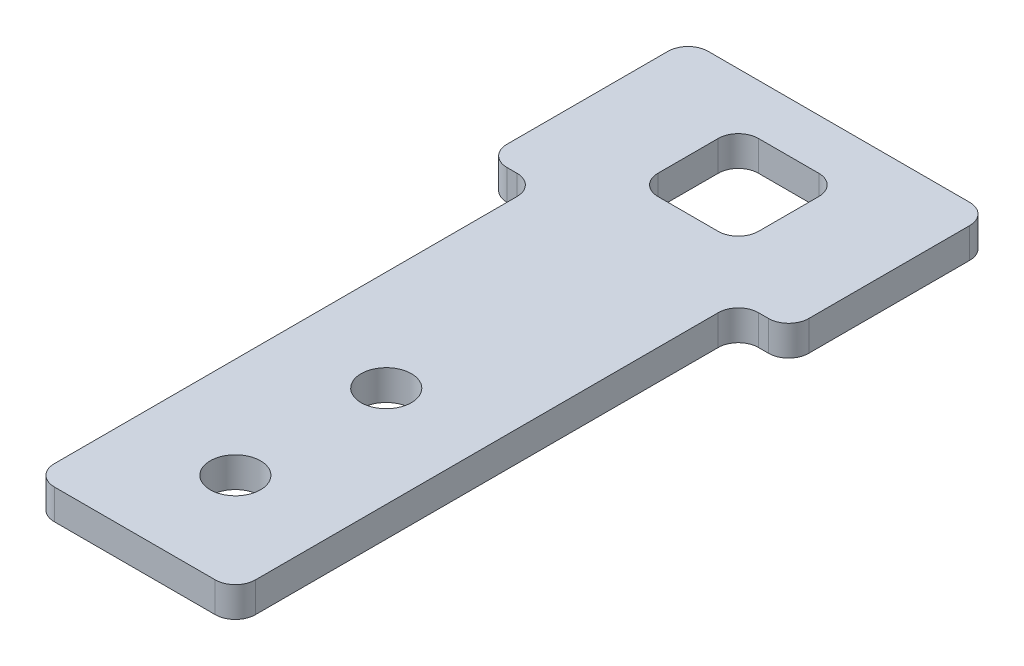
ISO-10303-21;
HEADER;
FILE_DESCRIPTION(('STEP AP214'),'2;1');
FILE_NAME('part.step','',(''),(''),'','','');
FILE_SCHEMA(('AUTOMOTIVE_DESIGN { 1 0 10303 214 1 1 1 1 }'));
ENDSEC;
DATA;
#1=APPLICATION_CONTEXT('core data for automotive mechanical design processes');
#2=APPLICATION_PROTOCOL_DEFINITION('international standard','automotive_design',2000,#1);
#3=PRODUCT_CONTEXT('',#1,'mechanical');
#4=PRODUCT('Part','Part','',(#3));
#5=PRODUCT_RELATED_PRODUCT_CATEGORY('part','',(#4));
#6=PRODUCT_DEFINITION_FORMATION('','',#4);
#7=PRODUCT_DEFINITION_CONTEXT('part definition',#1,'design');
#8=PRODUCT_DEFINITION('design','',#6,#7);
#9=PRODUCT_DEFINITION_SHAPE('','',#8);
#10=(LENGTH_UNIT() NAMED_UNIT(*) SI_UNIT(.MILLI.,.METRE.));
#11=(NAMED_UNIT(*) PLANE_ANGLE_UNIT() SI_UNIT($,.RADIAN.));
#12=(NAMED_UNIT(*) SI_UNIT($,.STERADIAN.) SOLID_ANGLE_UNIT());
#13=UNCERTAINTY_MEASURE_WITH_UNIT(LENGTH_MEASURE(1.E-05),#10,'distance_accuracy_value','');
#14=(GEOMETRIC_REPRESENTATION_CONTEXT(3) GLOBAL_UNCERTAINTY_ASSIGNED_CONTEXT((#13)) GLOBAL_UNIT_ASSIGNED_CONTEXT((#10,
#11,#12)) REPRESENTATION_CONTEXT('',''));
#15=CARTESIAN_POINT('',(0.,0.,0.));
#16=DIRECTION('',(0.,0.,1.));
#17=DIRECTION('',(1.,0.,0.));
#18=AXIS2_PLACEMENT_3D('',#15,#16,#17);
#19=CARTESIAN_POINT('',(5.00000000000001,-3.,0.));
#20=DIRECTION('',(-1.,0.,0.));
#21=DIRECTION('',(0.,0.,1.));
#22=AXIS2_PLACEMENT_3D('',#19,#20,#21);
#23=PLANE('',#22);
#24=DIRECTION('',(0.,0.,1.));
#25=VECTOR('',#24,1.);
#26=CARTESIAN_POINT('',(5.00000000000001,0.,0.));
#27=LINE('',#26,#25);
#28=CARTESIAN_POINT('',(5.,0.,-63.));
#29=VERTEX_POINT('',#28);
#30=CARTESIAN_POINT('',(5.,0.,-57.));
#31=VERTEX_POINT('',#30);
#32=EDGE_CURVE('E286',#29,#31,#27,.T.);
#33=ORIENTED_EDGE('',*,*,#32,.T.);
#34=DIRECTION('',(0.,1.,0.));
#35=VECTOR('',#34,1.);
#36=CARTESIAN_POINT('',(5.,-3.,-57.));
#37=LINE('',#36,#35);
#38=CARTESIAN_POINT('',(5.,-3.,-57.));
#39=VERTEX_POINT('',#38);
#40=EDGE_CURVE('E11',#39,#31,#37,.T.);
#41=ORIENTED_EDGE('',*,*,#40,.F.);
#42=DIRECTION('',(0.,0.,1.));
#43=VECTOR('',#42,1.);
#44=CARTESIAN_POINT('',(5.00000000000001,-3.,0.));
#45=LINE('',#44,#43);
#46=CARTESIAN_POINT('',(5.,-3.,-63.));
#47=VERTEX_POINT('',#46);
#48=EDGE_CURVE('E56',#47,#39,#45,.T.);
#49=ORIENTED_EDGE('',*,*,#48,.F.);
#50=DIRECTION('',(0.,1.,0.));
#51=VECTOR('',#50,1.);
#52=CARTESIAN_POINT('',(5.,-3.,-63.));
#53=LINE('',#52,#51);
#54=EDGE_CURVE('E315',#47,#29,#53,.T.);
#55=ORIENTED_EDGE('',*,*,#54,.T.);
#56=EDGE_LOOP('',(#33,#41,#49,#55));
#57=FACE_BOUND('',#56,.T.);
#58=ADVANCED_FACE('F37',(#57),#23,.F.);
#59=CARTESIAN_POINT('',(7.,-3.,-57.));
#60=DIRECTION('',(0.,1.,0.));
#61=DIRECTION('',(0.,0.,1.));
#62=AXIS2_PLACEMENT_3D('',#59,#60,#61);
#63=CYLINDRICAL_SURFACE('',#62,2.);
#64=CARTESIAN_POINT('',(7.,0.,-57.));
#65=DIRECTION('',(0.,1.,0.));
#66=DIRECTION('',(0.,0.,1.));
#67=AXIS2_PLACEMENT_3D('',#64,#65,#66);
#68=CIRCLE('',#67,2.);
#69=CARTESIAN_POINT('',(7.,0.,-55.));
#70=VERTEX_POINT('',#69);
#71=EDGE_CURVE('E303',#70,#31,#68,.F.);
#72=ORIENTED_EDGE('',*,*,#71,.F.);
#73=DIRECTION('',(0.,1.,0.));
#74=VECTOR('',#73,1.);
#75=CARTESIAN_POINT('',(7.,-3.,-55.));
#76=LINE('',#75,#74);
#77=CARTESIAN_POINT('',(7.,-3.,-55.));
#78=VERTEX_POINT('',#77);
#79=EDGE_CURVE('E47',#78,#70,#76,.T.);
#80=ORIENTED_EDGE('',*,*,#79,.F.);
#81=CARTESIAN_POINT('',(7.,-3.,-57.));
#82=DIRECTION('',(0.,1.,0.));
#83=DIRECTION('',(0.,0.,1.));
#84=AXIS2_PLACEMENT_3D('',#81,#82,#83);
#85=CIRCLE('',#84,2.);
#86=EDGE_CURVE('E212',#78,#39,#85,.F.);
#87=ORIENTED_EDGE('',*,*,#86,.T.);
#88=ORIENTED_EDGE('',*,*,#40,.T.);
#89=EDGE_LOOP('',(#72,#80,#87,#88));
#90=FACE_BOUND('',#89,.T.);
#91=ADVANCED_FACE('F372',(#90),#63,.F.);
#92=CARTESIAN_POINT('',(0.,-3.,-55.));
#93=DIRECTION('',(0.,0.,1.));
#94=DIRECTION('',(1.,0.,0.));
#95=AXIS2_PLACEMENT_3D('',#92,#93,#94);
#96=PLANE('',#95);
#97=DIRECTION('',(1.,0.,0.));
#98=VECTOR('',#97,1.);
#99=CARTESIAN_POINT('',(0.,0.,-55.));
#100=LINE('',#99,#98);
#101=CARTESIAN_POINT('',(13.,0.,-55.));
#102=VERTEX_POINT('',#101);
#103=EDGE_CURVE('E217',#70,#102,#100,.T.);
#104=ORIENTED_EDGE('',*,*,#103,.T.);
#105=DIRECTION('',(0.,1.,0.));
#106=VECTOR('',#105,1.);
#107=CARTESIAN_POINT('',(13.,-3.,-55.));
#108=LINE('',#107,#106);
#109=CARTESIAN_POINT('',(13.,-3.,-55.));
#110=VERTEX_POINT('',#109);
#111=EDGE_CURVE('E215',#110,#102,#108,.T.);
#112=ORIENTED_EDGE('',*,*,#111,.F.);
#113=DIRECTION('',(1.,0.,0.));
#114=VECTOR('',#113,1.);
#115=CARTESIAN_POINT('',(0.,-3.,-55.));
#116=LINE('',#115,#114);
#117=EDGE_CURVE('E205',#78,#110,#116,.T.);
#118=ORIENTED_EDGE('',*,*,#117,.F.);
#119=ORIENTED_EDGE('',*,*,#79,.T.);
#120=EDGE_LOOP('',(#104,#112,#118,#119));
#121=FACE_BOUND('',#120,.T.);
#122=ADVANCED_FACE('F216',(#121),#96,.F.);
#123=CARTESIAN_POINT('',(13.,-3.,-57.));
#124=DIRECTION('',(0.,1.,0.));
#125=DIRECTION('',(0.,0.,1.));
#126=AXIS2_PLACEMENT_3D('',#123,#124,#125);
#127=CYLINDRICAL_SURFACE('',#126,2.);
#128=CARTESIAN_POINT('',(13.,0.,-57.));
#129=DIRECTION('',(0.,1.,0.));
#130=DIRECTION('',(0.,0.,1.));
#131=AXIS2_PLACEMENT_3D('',#128,#129,#130);
#132=CIRCLE('',#131,2.);
#133=CARTESIAN_POINT('',(15.,0.,-57.));
#134=VERTEX_POINT('',#133);
#135=EDGE_CURVE('E300',#102,#134,#132,.T.);
#136=ORIENTED_EDGE('',*,*,#135,.T.);
#137=DIRECTION('',(0.,1.,0.));
#138=VECTOR('',#137,1.);
#139=CARTESIAN_POINT('',(15.,-3.,-57.));
#140=LINE('',#139,#138);
#141=CARTESIAN_POINT('',(15.,-3.,-57.));
#142=VERTEX_POINT('',#141);
#143=EDGE_CURVE('E221',#142,#134,#140,.T.);
#144=ORIENTED_EDGE('',*,*,#143,.F.);
#145=CARTESIAN_POINT('',(13.,-3.,-57.));
#146=DIRECTION('',(0.,1.,0.));
#147=DIRECTION('',(0.,0.,1.));
#148=AXIS2_PLACEMENT_3D('',#145,#146,#147);
#149=CIRCLE('',#148,2.);
#150=EDGE_CURVE('E210',#110,#142,#149,.T.);
#151=ORIENTED_EDGE('',*,*,#150,.F.);
#152=ORIENTED_EDGE('',*,*,#111,.T.);
#153=EDGE_LOOP('',(#136,#144,#151,#152));
#154=FACE_BOUND('',#153,.T.);
#155=ADVANCED_FACE('F223',(#154),#127,.F.);
#156=CARTESIAN_POINT('',(15.,-3.,0.));
#157=DIRECTION('',(-1.,0.,0.));
#158=DIRECTION('',(0.,0.,1.));
#159=AXIS2_PLACEMENT_3D('',#156,#157,#158);
#160=PLANE('',#159);
#161=DIRECTION('',(0.,0.,1.));
#162=VECTOR('',#161,1.);
#163=CARTESIAN_POINT('',(15.,0.,0.));
#164=LINE('',#163,#162);
#165=CARTESIAN_POINT('',(15.,0.,-63.));
#166=VERTEX_POINT('',#165);
#167=EDGE_CURVE('E297',#166,#134,#164,.T.);
#168=ORIENTED_EDGE('',*,*,#167,.F.);
#169=DIRECTION('',(0.,1.,0.));
#170=VECTOR('',#169,1.);
#171=CARTESIAN_POINT('',(15.,-3.,-63.));
#172=LINE('',#171,#170);
#173=CARTESIAN_POINT('',(15.,-3.,-63.));
#174=VERTEX_POINT('',#173);
#175=EDGE_CURVE('E309',#174,#166,#172,.T.);
#176=ORIENTED_EDGE('',*,*,#175,.F.);
#177=DIRECTION('',(0.,0.,1.));
#178=VECTOR('',#177,1.);
#179=CARTESIAN_POINT('',(15.,-3.,0.));
#180=LINE('',#179,#178);
#181=EDGE_CURVE('E225',#174,#142,#180,.T.);
#182=ORIENTED_EDGE('',*,*,#181,.T.);
#183=ORIENTED_EDGE('',*,*,#143,.T.);
#184=EDGE_LOOP('',(#168,#176,#182,#183));
#185=FACE_BOUND('',#184,.T.);
#186=ADVANCED_FACE('F504',(#185),#160,.T.);
#187=CARTESIAN_POINT('',(13.,-3.,-63.));
#188=DIRECTION('',(0.,1.,0.));
#189=DIRECTION('',(0.,0.,1.));
#190=AXIS2_PLACEMENT_3D('',#187,#188,#189);
#191=CYLINDRICAL_SURFACE('',#190,2.);
#192=CARTESIAN_POINT('',(13.,0.,-63.));
#193=DIRECTION('',(0.,1.,0.));
#194=DIRECTION('',(0.,0.,1.));
#195=AXIS2_PLACEMENT_3D('',#192,#193,#194);
#196=CIRCLE('',#195,2.);
#197=CARTESIAN_POINT('',(13.,0.,-65.));
#198=VERTEX_POINT('',#197);
#199=EDGE_CURVE('E294',#166,#198,#196,.T.);
#200=ORIENTED_EDGE('',*,*,#199,.T.);
#201=DIRECTION('',(0.,1.,0.));
#202=VECTOR('',#201,1.);
#203=CARTESIAN_POINT('',(13.,-3.,-65.));
#204=LINE('',#203,#202);
#205=CARTESIAN_POINT('',(13.,-3.,-65.));
#206=VERTEX_POINT('',#205);
#207=EDGE_CURVE('E311',#206,#198,#204,.T.);
#208=ORIENTED_EDGE('',*,*,#207,.F.);
#209=CARTESIAN_POINT('',(13.,-3.,-63.));
#210=DIRECTION('',(0.,1.,0.));
#211=DIRECTION('',(0.,0.,1.));
#212=AXIS2_PLACEMENT_3D('',#209,#210,#211);
#213=CIRCLE('',#212,2.);
#214=EDGE_CURVE('E227',#174,#206,#213,.T.);
#215=ORIENTED_EDGE('',*,*,#214,.F.);
#216=ORIENTED_EDGE('',*,*,#175,.T.);
#217=EDGE_LOOP('',(#200,#208,#215,#216));
#218=FACE_BOUND('',#217,.T.);
#219=ADVANCED_FACE('F494',(#218),#191,.F.);
#220=CARTESIAN_POINT('',(0.,-3.,-65.));
#221=DIRECTION('',(0.,0.,1.));
#222=DIRECTION('',(1.,0.,0.));
#223=AXIS2_PLACEMENT_3D('',#220,#221,#222);
#224=PLANE('',#223);
#225=DIRECTION('',(1.,0.,0.));
#226=VECTOR('',#225,1.);
#227=CARTESIAN_POINT('',(0.,0.,-65.));
#228=LINE('',#227,#226);
#229=CARTESIAN_POINT('',(7.,0.,-65.));
#230=VERTEX_POINT('',#229);
#231=EDGE_CURVE('E291',#230,#198,#228,.T.);
#232=ORIENTED_EDGE('',*,*,#231,.F.);
#233=DIRECTION('',(0.,1.,0.));
#234=VECTOR('',#233,1.);
#235=CARTESIAN_POINT('',(7.,-3.,-65.));
#236=LINE('',#235,#234);
#237=CARTESIAN_POINT('',(7.,-3.,-65.));
#238=VERTEX_POINT('',#237);
#239=EDGE_CURVE('E313',#238,#230,#236,.T.);
#240=ORIENTED_EDGE('',*,*,#239,.F.);
#241=DIRECTION('',(1.,0.,0.));
#242=VECTOR('',#241,1.);
#243=CARTESIAN_POINT('',(0.,-3.,-65.));
#244=LINE('',#243,#242);
#245=EDGE_CURVE('E488',#238,#206,#244,.T.);
#246=ORIENTED_EDGE('',*,*,#245,.T.);
#247=ORIENTED_EDGE('',*,*,#207,.T.);
#248=EDGE_LOOP('',(#232,#240,#246,#247));
#249=FACE_BOUND('',#248,.T.);
#250=ADVANCED_FACE('F498',(#249),#224,.T.);
#251=CARTESIAN_POINT('',(0.,-3.,-70.));
#252=DIRECTION('',(0.,0.,1.));
#253=DIRECTION('',(1.,0.,0.));
#254=AXIS2_PLACEMENT_3D('',#251,#252,#253);
#255=PLANE('',#254);
#256=DIRECTION('',(1.,0.,0.));
#257=VECTOR('',#256,1.);
#258=CARTESIAN_POINT('',(0.,0.,-70.));
#259=LINE('',#258,#257);
#260=CARTESIAN_POINT('',(-3.,0.,-70.));
#261=VERTEX_POINT('',#260);
#262=CARTESIAN_POINT('',(23.,0.,-70.));
#263=VERTEX_POINT('',#262);
#264=EDGE_CURVE('E238',#261,#263,#259,.T.);
#265=ORIENTED_EDGE('',*,*,#264,.T.);
#266=DIRECTION('',(0.,1.,0.));
#267=VECTOR('',#266,1.);
#268=CARTESIAN_POINT('',(23.,-3.,-70.));
#269=LINE('',#268,#267);
#270=CARTESIAN_POINT('',(23.,-3.,-70.));
#271=VERTEX_POINT('',#270);
#272=EDGE_CURVE('E317',#271,#263,#269,.T.);
#273=ORIENTED_EDGE('',*,*,#272,.F.);
#274=DIRECTION('',(1.,0.,0.));
#275=VECTOR('',#274,1.);
#276=CARTESIAN_POINT('',(0.,-3.,-70.));
#277=LINE('',#276,#275);
#278=CARTESIAN_POINT('',(-3.,-3.,-70.));
#279=VERTEX_POINT('',#278);
#280=EDGE_CURVE('E350',#279,#271,#277,.T.);
#281=ORIENTED_EDGE('',*,*,#280,.F.);
#282=DIRECTION('',(0.,1.,0.));
#283=VECTOR('',#282,1.);
#284=CARTESIAN_POINT('',(-3.,-3.,-70.));
#285=LINE('',#284,#283);
#286=EDGE_CURVE('E41',#279,#261,#285,.T.);
#287=ORIENTED_EDGE('',*,*,#286,.T.);
#288=EDGE_LOOP('',(#265,#273,#281,#287));
#289=FACE_BOUND('',#288,.T.);
#290=ADVANCED_FACE('F348',(#289),#255,.F.);
#291=CARTESIAN_POINT('',(23.,-3.,-68.));
#292=DIRECTION('',(0.,1.,0.));
#293=DIRECTION('',(0.,0.,1.));
#294=AXIS2_PLACEMENT_3D('',#291,#292,#293);
#295=CYLINDRICAL_SURFACE('',#294,2.);
#296=CARTESIAN_POINT('',(23.,0.,-68.));
#297=DIRECTION('',(0.,1.,0.));
#298=DIRECTION('',(0.,0.,1.));
#299=AXIS2_PLACEMENT_3D('',#296,#297,#298);
#300=CIRCLE('',#299,2.);
#301=CARTESIAN_POINT('',(25.,0.,-68.));
#302=VERTEX_POINT('',#301);
#303=EDGE_CURVE('E283',#302,#263,#300,.T.);
#304=ORIENTED_EDGE('',*,*,#303,.F.);
#305=DIRECTION('',(0.,1.,0.));
#306=VECTOR('',#305,1.);
#307=CARTESIAN_POINT('',(25.,-3.,-68.));
#308=LINE('',#307,#306);
#309=CARTESIAN_POINT('',(25.,-3.,-68.));
#310=VERTEX_POINT('',#309);
#311=EDGE_CURVE('E319',#310,#302,#308,.T.);
#312=ORIENTED_EDGE('',*,*,#311,.F.);
#313=CARTESIAN_POINT('',(23.,-3.,-68.));
#314=DIRECTION('',(0.,1.,0.));
#315=DIRECTION('',(0.,0.,1.));
#316=AXIS2_PLACEMENT_3D('',#313,#314,#315);
#317=CIRCLE('',#316,2.);
#318=EDGE_CURVE('E481',#310,#271,#317,.T.);
#319=ORIENTED_EDGE('',*,*,#318,.T.);
#320=ORIENTED_EDGE('',*,*,#272,.T.);
#321=EDGE_LOOP('',(#304,#312,#319,#320));
#322=FACE_BOUND('',#321,.T.);
#323=ADVANCED_FACE('F383',(#322),#295,.T.);
#324=CARTESIAN_POINT('',(25.,-3.,0.));
#325=DIRECTION('',(-1.,0.,0.));
#326=DIRECTION('',(0.,0.,1.));
#327=AXIS2_PLACEMENT_3D('',#324,#325,#326);
#328=PLANE('',#327);
#329=DIRECTION('',(0.,0.,1.));
#330=VECTOR('',#329,1.);
#331=CARTESIAN_POINT('',(25.,0.,0.));
#332=LINE('',#331,#330);
#333=CARTESIAN_POINT('',(25.,0.,-52.));
#334=VERTEX_POINT('',#333);
#335=EDGE_CURVE('E280',#302,#334,#332,.T.);
#336=ORIENTED_EDGE('',*,*,#335,.T.);
#337=DIRECTION('',(0.,1.,0.));
#338=VECTOR('',#337,1.);
#339=CARTESIAN_POINT('',(25.,-3.,-52.));
#340=LINE('',#339,#338);
#341=CARTESIAN_POINT('',(25.,-3.,-52.));
#342=VERTEX_POINT('',#341);
#343=EDGE_CURVE('E321',#342,#334,#340,.T.);
#344=ORIENTED_EDGE('',*,*,#343,.F.);
#345=DIRECTION('',(0.,0.,1.));
#346=VECTOR('',#345,1.);
#347=CARTESIAN_POINT('',(25.,-3.,0.));
#348=LINE('',#347,#346);
#349=EDGE_CURVE('E479',#310,#342,#348,.T.);
#350=ORIENTED_EDGE('',*,*,#349,.F.);
#351=ORIENTED_EDGE('',*,*,#311,.T.);
#352=EDGE_LOOP('',(#336,#344,#350,#351));
#353=FACE_BOUND('',#352,.T.);
#354=ADVANCED_FACE('F386',(#353),#328,.F.);
#355=CARTESIAN_POINT('',(23.,-3.,-52.));
#356=DIRECTION('',(0.,1.,0.));
#357=DIRECTION('',(0.,0.,1.));
#358=AXIS2_PLACEMENT_3D('',#355,#356,#357);
#359=CYLINDRICAL_SURFACE('',#358,2.);
#360=CARTESIAN_POINT('',(23.,0.,-52.));
#361=DIRECTION('',(0.,1.,0.));
#362=DIRECTION('',(0.,0.,1.));
#363=AXIS2_PLACEMENT_3D('',#360,#361,#362);
#364=CIRCLE('',#363,2.);
#365=CARTESIAN_POINT('',(23.,0.,-50.));
#366=VERTEX_POINT('',#365);
#367=EDGE_CURVE('E277',#366,#334,#364,.T.);
#368=ORIENTED_EDGE('',*,*,#367,.F.);
#369=DIRECTION('',(0.,1.,0.));
#370=VECTOR('',#369,1.);
#371=CARTESIAN_POINT('',(23.,-3.,-50.));
#372=LINE('',#371,#370);
#373=CARTESIAN_POINT('',(23.,-3.,-50.));
#374=VERTEX_POINT('',#373);
#375=EDGE_CURVE('E323',#374,#366,#372,.T.);
#376=ORIENTED_EDGE('',*,*,#375,.F.);
#377=CARTESIAN_POINT('',(23.,-3.,-52.));
#378=DIRECTION('',(0.,1.,0.));
#379=DIRECTION('',(0.,0.,1.));
#380=AXIS2_PLACEMENT_3D('',#377,#378,#379);
#381=CIRCLE('',#380,2.);
#382=EDGE_CURVE('E476',#374,#342,#381,.T.);
#383=ORIENTED_EDGE('',*,*,#382,.T.);
#384=ORIENTED_EDGE('',*,*,#343,.T.);
#385=EDGE_LOOP('',(#368,#376,#383,#384));
#386=FACE_BOUND('',#385,.T.);
#387=ADVANCED_FACE('F390',(#386),#359,.T.);
#388=CARTESIAN_POINT('',(0.,-3.,-50.));
#389=DIRECTION('',(0.,0.,1.));
#390=DIRECTION('',(1.,0.,0.));
#391=AXIS2_PLACEMENT_3D('',#388,#389,#390);
#392=PLANE('',#391);
#393=DIRECTION('',(1.,0.,0.));
#394=VECTOR('',#393,1.);
#395=CARTESIAN_POINT('',(0.,0.,-50.));
#396=LINE('',#395,#394);
#397=CARTESIAN_POINT('',(22.,0.,-50.));
#398=VERTEX_POINT('',#397);
#399=EDGE_CURVE('E274',#398,#366,#396,.T.);
#400=ORIENTED_EDGE('',*,*,#399,.F.);
#401=DIRECTION('',(0.,1.,0.));
#402=VECTOR('',#401,1.);
#403=CARTESIAN_POINT('',(22.,-3.,-50.));
#404=LINE('',#403,#402);
#405=CARTESIAN_POINT('',(22.,-3.,-50.));
#406=VERTEX_POINT('',#405);
#407=EDGE_CURVE('E325',#406,#398,#404,.T.);
#408=ORIENTED_EDGE('',*,*,#407,.F.);
#409=DIRECTION('',(1.,0.,0.));
#410=VECTOR('',#409,1.);
#411=CARTESIAN_POINT('',(0.,-3.,-50.));
#412=LINE('',#411,#410);
#413=EDGE_CURVE('E473',#406,#374,#412,.T.);
#414=ORIENTED_EDGE('',*,*,#413,.T.);
#415=ORIENTED_EDGE('',*,*,#375,.T.);
#416=EDGE_LOOP('',(#400,#408,#414,#415));
#417=FACE_BOUND('',#416,.T.);
#418=ADVANCED_FACE('F394',(#417),#392,.T.);
#419=CARTESIAN_POINT('',(22.,-3.,-48.));
#420=DIRECTION('',(0.,1.,0.));
#421=DIRECTION('',(0.,0.,1.));
#422=AXIS2_PLACEMENT_3D('',#419,#420,#421);
#423=CYLINDRICAL_SURFACE('',#422,2.);
#424=CARTESIAN_POINT('',(22.,0.,-48.));
#425=DIRECTION('',(0.,1.,0.));
#426=DIRECTION('',(0.,0.,1.));
#427=AXIS2_PLACEMENT_3D('',#424,#425,#426);
#428=CIRCLE('',#427,2.);
#429=CARTESIAN_POINT('',(20.,0.,-48.));
#430=VERTEX_POINT('',#429);
#431=EDGE_CURVE('E271',#430,#398,#428,.F.);
#432=ORIENTED_EDGE('',*,*,#431,.F.);
#433=DIRECTION('',(0.,1.,0.));
#434=VECTOR('',#433,1.);
#435=CARTESIAN_POINT('',(20.,-3.,-48.));
#436=LINE('',#435,#434);
#437=CARTESIAN_POINT('',(20.,-3.,-48.));
#438=VERTEX_POINT('',#437);
#439=EDGE_CURVE('E327',#438,#430,#436,.T.);
#440=ORIENTED_EDGE('',*,*,#439,.F.);
#441=CARTESIAN_POINT('',(22.,-3.,-48.));
#442=DIRECTION('',(0.,1.,0.));
#443=DIRECTION('',(0.,0.,1.));
#444=AXIS2_PLACEMENT_3D('',#441,#442,#443);
#445=CIRCLE('',#444,2.);
#446=EDGE_CURVE('E470',#438,#406,#445,.F.);
#447=ORIENTED_EDGE('',*,*,#446,.T.);
#448=ORIENTED_EDGE('',*,*,#407,.T.);
#449=EDGE_LOOP('',(#432,#440,#447,#448));
#450=FACE_BOUND('',#449,.T.);
#451=ADVANCED_FACE('F398',(#450),#423,.F.);
#452=CARTESIAN_POINT('',(20.,-3.,0.));
#453=DIRECTION('',(-1.,0.,0.));
#454=DIRECTION('',(0.,0.,1.));
#455=AXIS2_PLACEMENT_3D('',#452,#453,#454);
#456=PLANE('',#455);
#457=DIRECTION('',(0.,0.,1.));
#458=VECTOR('',#457,1.);
#459=CARTESIAN_POINT('',(20.,0.,0.));
#460=LINE('',#459,#458);
#461=CARTESIAN_POINT('',(20.,0.,-2.00000000000001));
#462=VERTEX_POINT('',#461);
#463=EDGE_CURVE('E268',#430,#462,#460,.T.);
#464=ORIENTED_EDGE('',*,*,#463,.T.);
#465=DIRECTION('',(0.,1.,0.));
#466=VECTOR('',#465,1.);
#467=CARTESIAN_POINT('',(20.,-3.,-2.00000000000001));
#468=LINE('',#467,#466);
#469=CARTESIAN_POINT('',(20.,-3.,-2.00000000000001));
#470=VERTEX_POINT('',#469);
#471=EDGE_CURVE('E329',#470,#462,#468,.T.);
#472=ORIENTED_EDGE('',*,*,#471,.F.);
#473=DIRECTION('',(0.,0.,1.));
#474=VECTOR('',#473,1.);
#475=CARTESIAN_POINT('',(20.,-3.,0.));
#476=LINE('',#475,#474);
#477=EDGE_CURVE('E468',#438,#470,#476,.T.);
#478=ORIENTED_EDGE('',*,*,#477,.F.);
#479=ORIENTED_EDGE('',*,*,#439,.T.);
#480=EDGE_LOOP('',(#464,#472,#478,#479));
#481=FACE_BOUND('',#480,.T.);
#482=ADVANCED_FACE('F402',(#481),#456,.F.);
#483=CARTESIAN_POINT('',(18.,-3.,-2.));
#484=DIRECTION('',(0.,1.,0.));
#485=DIRECTION('',(0.,0.,1.));
#486=AXIS2_PLACEMENT_3D('',#483,#484,#485);
#487=CYLINDRICAL_SURFACE('',#486,2.);
#488=CARTESIAN_POINT('',(18.,0.,-2.));
#489=DIRECTION('',(0.,1.,0.));
#490=DIRECTION('',(0.,0.,1.));
#491=AXIS2_PLACEMENT_3D('',#488,#489,#490);
#492=CIRCLE('',#491,2.);
#493=CARTESIAN_POINT('',(18.,0.,0.));
#494=VERTEX_POINT('',#493);
#495=EDGE_CURVE('E265',#494,#462,#492,.T.);
#496=ORIENTED_EDGE('',*,*,#495,.F.);
#497=DIRECTION('',(0.,1.,0.));
#498=VECTOR('',#497,1.);
#499=CARTESIAN_POINT('',(18.,-3.,0.));
#500=LINE('',#499,#498);
#501=CARTESIAN_POINT('',(18.,-3.,0.));
#502=VERTEX_POINT('',#501);
#503=EDGE_CURVE('E331',#502,#494,#500,.T.);
#504=ORIENTED_EDGE('',*,*,#503,.F.);
#505=CARTESIAN_POINT('',(18.,-3.,-2.));
#506=DIRECTION('',(0.,1.,0.));
#507=DIRECTION('',(0.,0.,1.));
#508=AXIS2_PLACEMENT_3D('',#505,#506,#507);
#509=CIRCLE('',#508,2.);
#510=EDGE_CURVE('E465',#502,#470,#509,.T.);
#511=ORIENTED_EDGE('',*,*,#510,.T.);
#512=ORIENTED_EDGE('',*,*,#471,.T.);
#513=EDGE_LOOP('',(#496,#504,#511,#512));
#514=FACE_BOUND('',#513,.T.);
#515=ADVANCED_FACE('F406',(#514),#487,.T.);
#516=CARTESIAN_POINT('',(0.,-3.,0.));
#517=DIRECTION('',(0.,0.,1.));
#518=DIRECTION('',(1.,0.,0.));
#519=AXIS2_PLACEMENT_3D('',#516,#517,#518);
#520=PLANE('',#519);
#521=DIRECTION('',(1.,0.,0.));
#522=VECTOR('',#521,1.);
#523=CARTESIAN_POINT('',(0.,0.,0.));
#524=LINE('',#523,#522);
#525=CARTESIAN_POINT('',(2.00000000000001,0.,0.));
#526=VERTEX_POINT('',#525);
#527=EDGE_CURVE('E262',#526,#494,#524,.T.);
#528=ORIENTED_EDGE('',*,*,#527,.F.);
#529=DIRECTION('',(0.,1.,0.));
#530=VECTOR('',#529,1.);
#531=CARTESIAN_POINT('',(2.00000000000001,-3.,0.));
#532=LINE('',#531,#530);
#533=CARTESIAN_POINT('',(2.00000000000001,-3.,0.));
#534=VERTEX_POINT('',#533);
#535=EDGE_CURVE('E333',#534,#526,#532,.T.);
#536=ORIENTED_EDGE('',*,*,#535,.F.);
#537=DIRECTION('',(1.,0.,0.));
#538=VECTOR('',#537,1.);
#539=CARTESIAN_POINT('',(0.,-3.,0.));
#540=LINE('',#539,#538);
#541=EDGE_CURVE('E462',#534,#502,#540,.T.);
#542=ORIENTED_EDGE('',*,*,#541,.T.);
#543=ORIENTED_EDGE('',*,*,#503,.T.);
#544=EDGE_LOOP('',(#528,#536,#542,#543));
#545=FACE_BOUND('',#544,.T.);
#546=ADVANCED_FACE('F410',(#545),#520,.T.);
#547=CARTESIAN_POINT('',(2.,-3.,-2.));
#548=DIRECTION('',(0.,1.,0.));
#549=DIRECTION('',(0.,0.,1.));
#550=AXIS2_PLACEMENT_3D('',#547,#548,#549);
#551=CYLINDRICAL_SURFACE('',#550,2.);
#552=CARTESIAN_POINT('',(2.,0.,-2.));
#553=DIRECTION('',(0.,1.,0.));
#554=DIRECTION('',(0.,0.,1.));
#555=AXIS2_PLACEMENT_3D('',#552,#553,#554);
#556=CIRCLE('',#555,2.);
#557=CARTESIAN_POINT('',(0.,0.,-2.00000000000001));
#558=VERTEX_POINT('',#557);
#559=EDGE_CURVE('E259',#558,#526,#556,.T.);
#560=ORIENTED_EDGE('',*,*,#559,.F.);
#561=DIRECTION('',(0.,1.,0.));
#562=VECTOR('',#561,1.);
#563=CARTESIAN_POINT('',(0.,-3.,-2.00000000000001));
#564=LINE('',#563,#562);
#565=CARTESIAN_POINT('',(0.,-3.,-2.00000000000001));
#566=VERTEX_POINT('',#565);
#567=EDGE_CURVE('E335',#566,#558,#564,.T.);
#568=ORIENTED_EDGE('',*,*,#567,.F.);
#569=CARTESIAN_POINT('',(2.,-3.,-2.));
#570=DIRECTION('',(0.,1.,0.));
#571=DIRECTION('',(0.,0.,1.));
#572=AXIS2_PLACEMENT_3D('',#569,#570,#571);
#573=CIRCLE('',#572,2.);
#574=EDGE_CURVE('E459',#566,#534,#573,.T.);
#575=ORIENTED_EDGE('',*,*,#574,.T.);
#576=ORIENTED_EDGE('',*,*,#535,.T.);
#577=EDGE_LOOP('',(#560,#568,#575,#576));
#578=FACE_BOUND('',#577,.T.);
#579=ADVANCED_FACE('F414',(#578),#551,.T.);
#580=CARTESIAN_POINT('',(0.,-3.,0.));
#581=DIRECTION('',(-1.,0.,0.));
#582=DIRECTION('',(0.,0.,1.));
#583=AXIS2_PLACEMENT_3D('',#580,#581,#582);
#584=PLANE('',#583);
#585=DIRECTION('',(0.,0.,1.));
#586=VECTOR('',#585,1.);
#587=CARTESIAN_POINT('',(0.,0.,0.));
#588=LINE('',#587,#586);
#589=CARTESIAN_POINT('',(0.,0.,-48.));
#590=VERTEX_POINT('',#589);
#591=EDGE_CURVE('E256',#590,#558,#588,.T.);
#592=ORIENTED_EDGE('',*,*,#591,.F.);
#593=DIRECTION('',(0.,1.,0.));
#594=VECTOR('',#593,1.);
#595=CARTESIAN_POINT('',(0.,-3.,-48.));
#596=LINE('',#595,#594);
#597=CARTESIAN_POINT('',(0.,-3.,-48.));
#598=VERTEX_POINT('',#597);
#599=EDGE_CURVE('E337',#598,#590,#596,.T.);
#600=ORIENTED_EDGE('',*,*,#599,.F.);
#601=DIRECTION('',(0.,0.,1.));
#602=VECTOR('',#601,1.);
#603=CARTESIAN_POINT('',(0.,-3.,0.));
#604=LINE('',#603,#602);
#605=EDGE_CURVE('E456',#598,#566,#604,.T.);
#606=ORIENTED_EDGE('',*,*,#605,.T.);
#607=ORIENTED_EDGE('',*,*,#567,.T.);
#608=EDGE_LOOP('',(#592,#600,#606,#607));
#609=FACE_BOUND('',#608,.T.);
#610=ADVANCED_FACE('F418',(#609),#584,.T.);
#611=CARTESIAN_POINT('',(-2.,-3.,-48.));
#612=DIRECTION('',(0.,1.,0.));
#613=DIRECTION('',(0.,0.,1.));
#614=AXIS2_PLACEMENT_3D('',#611,#612,#613);
#615=CYLINDRICAL_SURFACE('',#614,2.);
#616=CARTESIAN_POINT('',(-2.,0.,-48.));
#617=DIRECTION('',(0.,1.,0.));
#618=DIRECTION('',(0.,0.,1.));
#619=AXIS2_PLACEMENT_3D('',#616,#617,#618);
#620=CIRCLE('',#619,2.);
#621=CARTESIAN_POINT('',(-2.,0.,-50.));
#622=VERTEX_POINT('',#621);
#623=EDGE_CURVE('E253',#622,#590,#620,.F.);
#624=ORIENTED_EDGE('',*,*,#623,.F.);
#625=DIRECTION('',(0.,1.,0.));
#626=VECTOR('',#625,1.);
#627=CARTESIAN_POINT('',(-2.,-3.,-50.));
#628=LINE('',#627,#626);
#629=CARTESIAN_POINT('',(-2.,-3.,-50.));
#630=VERTEX_POINT('',#629);
#631=EDGE_CURVE('E339',#630,#622,#628,.T.);
#632=ORIENTED_EDGE('',*,*,#631,.F.);
#633=CARTESIAN_POINT('',(-2.,-3.,-48.));
#634=DIRECTION('',(0.,1.,0.));
#635=DIRECTION('',(0.,0.,1.));
#636=AXIS2_PLACEMENT_3D('',#633,#634,#635);
#637=CIRCLE('',#636,2.);
#638=EDGE_CURVE('E453',#630,#598,#637,.F.);
#639=ORIENTED_EDGE('',*,*,#638,.T.);
#640=ORIENTED_EDGE('',*,*,#599,.T.);
#641=EDGE_LOOP('',(#624,#632,#639,#640));
#642=FACE_BOUND('',#641,.T.);
#643=ADVANCED_FACE('F422',(#642),#615,.F.);
#644=CARTESIAN_POINT('',(0.,-3.,-50.));
#645=DIRECTION('',(0.,0.,1.));
#646=DIRECTION('',(1.,0.,0.));
#647=AXIS2_PLACEMENT_3D('',#644,#645,#646);
#648=PLANE('',#647);
#649=DIRECTION('',(1.,0.,0.));
#650=VECTOR('',#649,1.);
#651=CARTESIAN_POINT('',(0.,0.,-50.));
#652=LINE('',#651,#650);
#653=CARTESIAN_POINT('',(-3.,0.,-50.));
#654=VERTEX_POINT('',#653);
#655=EDGE_CURVE('E250',#654,#622,#652,.T.);
#656=ORIENTED_EDGE('',*,*,#655,.F.);
#657=DIRECTION('',(0.,1.,0.));
#658=VECTOR('',#657,1.);
#659=CARTESIAN_POINT('',(-3.,-3.,-50.));
#660=LINE('',#659,#658);
#661=CARTESIAN_POINT('',(-3.,-3.,-50.));
#662=VERTEX_POINT('',#661);
#663=EDGE_CURVE('E341',#662,#654,#660,.T.);
#664=ORIENTED_EDGE('',*,*,#663,.F.);
#665=DIRECTION('',(1.,0.,0.));
#666=VECTOR('',#665,1.);
#667=CARTESIAN_POINT('',(0.,-3.,-50.));
#668=LINE('',#667,#666);
#669=EDGE_CURVE('E446',#662,#630,#668,.T.);
#670=ORIENTED_EDGE('',*,*,#669,.T.);
#671=ORIENTED_EDGE('',*,*,#631,.T.);
#672=EDGE_LOOP('',(#656,#664,#670,#671));
#673=FACE_BOUND('',#672,.T.);
#674=ADVANCED_FACE('F426',(#673),#648,.T.);
#675=CARTESIAN_POINT('',(-3.,-3.,-52.));
#676=DIRECTION('',(0.,1.,0.));
#677=DIRECTION('',(0.,0.,1.));
#678=AXIS2_PLACEMENT_3D('',#675,#676,#677);
#679=CYLINDRICAL_SURFACE('',#678,2.);
#680=CARTESIAN_POINT('',(-3.,0.,-52.));
#681=DIRECTION('',(0.,1.,0.));
#682=DIRECTION('',(0.,0.,1.));
#683=AXIS2_PLACEMENT_3D('',#680,#681,#682);
#684=CIRCLE('',#683,2.);
#685=CARTESIAN_POINT('',(-5.,0.,-52.));
#686=VERTEX_POINT('',#685);
#687=EDGE_CURVE('E247',#686,#654,#684,.T.);
#688=ORIENTED_EDGE('',*,*,#687,.F.);
#689=DIRECTION('',(0.,1.,0.));
#690=VECTOR('',#689,1.);
#691=CARTESIAN_POINT('',(-5.,-3.,-52.));
#692=LINE('',#691,#690);
#693=CARTESIAN_POINT('',(-5.,-3.,-52.));
#694=VERTEX_POINT('',#693);
#695=EDGE_CURVE('E343',#694,#686,#692,.T.);
#696=ORIENTED_EDGE('',*,*,#695,.F.);
#697=CARTESIAN_POINT('',(-3.,-3.,-52.));
#698=DIRECTION('',(0.,1.,0.));
#699=DIRECTION('',(0.,0.,1.));
#700=AXIS2_PLACEMENT_3D('',#697,#698,#699);
#701=CIRCLE('',#700,2.);
#702=EDGE_CURVE('E443',#694,#662,#701,.T.);
#703=ORIENTED_EDGE('',*,*,#702,.T.);
#704=ORIENTED_EDGE('',*,*,#663,.T.);
#705=EDGE_LOOP('',(#688,#696,#703,#704));
#706=FACE_BOUND('',#705,.T.);
#707=ADVANCED_FACE('F367',(#706),#679,.T.);
#708=CARTESIAN_POINT('',(-4.99999999999999,-3.,0.));
#709=DIRECTION('',(-1.,0.,0.));
#710=DIRECTION('',(0.,0.,1.));
#711=AXIS2_PLACEMENT_3D('',#708,#709,#710);
#712=PLANE('',#711);
#713=DIRECTION('',(0.,0.,1.));
#714=VECTOR('',#713,1.);
#715=CARTESIAN_POINT('',(-4.99999999999999,0.,0.));
#716=LINE('',#715,#714);
#717=CARTESIAN_POINT('',(-5.,0.,-68.));
#718=VERTEX_POINT('',#717);
#719=EDGE_CURVE('E244',#718,#686,#716,.T.);
#720=ORIENTED_EDGE('',*,*,#719,.F.);
#721=DIRECTION('',(0.,1.,0.));
#722=VECTOR('',#721,1.);
#723=CARTESIAN_POINT('',(-5.,-3.,-68.));
#724=LINE('',#723,#722);
#725=CARTESIAN_POINT('',(-5.,-3.,-68.));
#726=VERTEX_POINT('',#725);
#727=EDGE_CURVE('E344',#726,#718,#724,.T.);
#728=ORIENTED_EDGE('',*,*,#727,.F.);
#729=DIRECTION('',(0.,0.,1.));
#730=VECTOR('',#729,1.);
#731=CARTESIAN_POINT('',(-4.99999999999999,-3.,0.));
#732=LINE('',#731,#730);
#733=EDGE_CURVE('E441',#726,#694,#732,.T.);
#734=ORIENTED_EDGE('',*,*,#733,.T.);
#735=ORIENTED_EDGE('',*,*,#695,.T.);
#736=EDGE_LOOP('',(#720,#728,#734,#735));
#737=FACE_BOUND('',#736,.T.);
#738=ADVANCED_FACE('F360',(#737),#712,.T.);
#739=CARTESIAN_POINT('',(-3.,-3.,-68.));
#740=DIRECTION('',(0.,1.,0.));
#741=DIRECTION('',(0.,0.,1.));
#742=AXIS2_PLACEMENT_3D('',#739,#740,#741);
#743=CYLINDRICAL_SURFACE('',#742,2.);
#744=CARTESIAN_POINT('',(-3.,0.,-68.));
#745=DIRECTION('',(0.,1.,0.));
#746=DIRECTION('',(0.,0.,1.));
#747=AXIS2_PLACEMENT_3D('',#744,#745,#746);
#748=CIRCLE('',#747,2.);
#749=EDGE_CURVE('E241',#261,#718,#748,.T.);
#750=ORIENTED_EDGE('',*,*,#749,.F.);
#751=ORIENTED_EDGE('',*,*,#286,.F.);
#752=CARTESIAN_POINT('',(-3.,-3.,-68.));
#753=DIRECTION('',(0.,1.,0.));
#754=DIRECTION('',(0.,0.,1.));
#755=AXIS2_PLACEMENT_3D('',#752,#753,#754);
#756=CIRCLE('',#755,2.);
#757=EDGE_CURVE('E444',#279,#726,#756,.T.);
#758=ORIENTED_EDGE('',*,*,#757,.T.);
#759=ORIENTED_EDGE('',*,*,#727,.T.);
#760=EDGE_LOOP('',(#750,#751,#758,#759));
#761=FACE_BOUND('',#760,.T.);
#762=ADVANCED_FACE('F357',(#761),#743,.T.);
#763=CARTESIAN_POINT('',(10.,-3.,-10.));
#764=DIRECTION('',(0.,1.,0.));
#765=DIRECTION('',(0.,0.,1.));
#766=AXIS2_PLACEMENT_3D('',#763,#764,#765);
#767=CYLINDRICAL_SURFACE('',#766,2.5);
#768=CARTESIAN_POINT('',(10.,-3.,-10.));
#769=DIRECTION('',(0.,1.,0.));
#770=DIRECTION('',(0.,0.,1.));
#771=AXIS2_PLACEMENT_3D('',#768,#769,#770);
#772=CIRCLE('',#771,2.5);
#773=CARTESIAN_POINT('',(10.,-3.,-7.5));
#774=VERTEX_POINT('',#773);
#775=EDGE_CURVE('E699',#774,#774,#772,.T.);
#776=ORIENTED_EDGE('',*,*,#775,.F.);
#777=EDGE_LOOP('',(#776));
#778=FACE_BOUND('',#777,.T.);
#779=CARTESIAN_POINT('',(10.,0.,-10.));
#780=DIRECTION('',(0.,1.,0.));
#781=DIRECTION('',(0.,0.,1.));
#782=AXIS2_PLACEMENT_3D('',#779,#780,#781);
#783=CIRCLE('',#782,2.5);
#784=CARTESIAN_POINT('',(10.,0.,-7.5));
#785=VERTEX_POINT('',#784);
#786=EDGE_CURVE('E235',#785,#785,#783,.T.);
#787=ORIENTED_EDGE('',*,*,#786,.T.);
#788=EDGE_LOOP('',(#787));
#789=FACE_BOUND('',#788,.T.);
#790=ADVANCED_FACE('F359',(#778,#789),#767,.F.);
#791=CARTESIAN_POINT('',(10.,-3.,-25.));
#792=DIRECTION('',(0.,1.,0.));
#793=DIRECTION('',(0.,0.,1.));
#794=AXIS2_PLACEMENT_3D('',#791,#792,#793);
#795=CYLINDRICAL_SURFACE('',#794,2.5);
#796=CARTESIAN_POINT('',(10.,-3.,-25.));
#797=DIRECTION('',(0.,1.,0.));
#798=DIRECTION('',(0.,0.,1.));
#799=AXIS2_PLACEMENT_3D('',#796,#797,#798);
#800=CIRCLE('',#799,2.5);
#801=CARTESIAN_POINT('',(10.,-3.,-22.5));
#802=VERTEX_POINT('',#801);
#803=EDGE_CURVE('E305',#802,#802,#800,.T.);
#804=ORIENTED_EDGE('',*,*,#803,.F.);
#805=EDGE_LOOP('',(#804));
#806=FACE_BOUND('',#805,.T.);
#807=CARTESIAN_POINT('',(10.,0.,-25.));
#808=DIRECTION('',(0.,1.,0.));
#809=DIRECTION('',(0.,0.,1.));
#810=AXIS2_PLACEMENT_3D('',#807,#808,#809);
#811=CIRCLE('',#810,2.5);
#812=CARTESIAN_POINT('',(10.,0.,-22.5));
#813=VERTEX_POINT('',#812);
#814=EDGE_CURVE('E232',#813,#813,#811,.T.);
#815=ORIENTED_EDGE('',*,*,#814,.T.);
#816=EDGE_LOOP('',(#815));
#817=FACE_BOUND('',#816,.T.);
#818=ADVANCED_FACE('F39',(#806,#817),#795,.F.);
#819=CARTESIAN_POINT('',(7.,-3.,-63.));
#820=DIRECTION('',(0.,1.,0.));
#821=DIRECTION('',(0.,0.,1.));
#822=AXIS2_PLACEMENT_3D('',#819,#820,#821);
#823=CYLINDRICAL_SURFACE('',#822,2.);
#824=CARTESIAN_POINT('',(7.,0.,-63.));
#825=DIRECTION('',(0.,1.,0.));
#826=DIRECTION('',(0.,0.,1.));
#827=AXIS2_PLACEMENT_3D('',#824,#825,#826);
#828=CIRCLE('',#827,2.);
#829=EDGE_CURVE('E288',#29,#230,#828,.F.);
#830=ORIENTED_EDGE('',*,*,#829,.F.);
#831=ORIENTED_EDGE('',*,*,#54,.F.);
#832=CARTESIAN_POINT('',(7.,-3.,-63.));
#833=DIRECTION('',(0.,1.,0.));
#834=DIRECTION('',(0.,0.,1.));
#835=AXIS2_PLACEMENT_3D('',#832,#833,#834);
#836=CIRCLE('',#835,2.);
#837=EDGE_CURVE('E485',#47,#238,#836,.F.);
#838=ORIENTED_EDGE('',*,*,#837,.T.);
#839=ORIENTED_EDGE('',*,*,#239,.T.);
#840=EDGE_LOOP('',(#830,#831,#838,#839));
#841=FACE_BOUND('',#840,.T.);
#842=ADVANCED_FACE('F381',(#841),#823,.F.);
#843=CARTESIAN_POINT('',(0.,-3.,0.));
#844=DIRECTION('',(0.,1.,0.));
#845=DIRECTION('',(0.,0.,1.));
#846=AXIS2_PLACEMENT_3D('',#843,#844,#845);
#847=PLANE('',#846);
#848=ORIENTED_EDGE('',*,*,#803,.T.);
#849=EDGE_LOOP('',(#848));
#850=FACE_BOUND('',#849,.T.);
#851=ORIENTED_EDGE('',*,*,#775,.T.);
#852=EDGE_LOOP('',(#851));
#853=FACE_BOUND('',#852,.T.);
#854=ORIENTED_EDGE('',*,*,#280,.T.);
#855=ORIENTED_EDGE('',*,*,#318,.F.);
#856=ORIENTED_EDGE('',*,*,#349,.T.);
#857=ORIENTED_EDGE('',*,*,#382,.F.);
#858=ORIENTED_EDGE('',*,*,#413,.F.);
#859=ORIENTED_EDGE('',*,*,#446,.F.);
#860=ORIENTED_EDGE('',*,*,#477,.T.);
#861=ORIENTED_EDGE('',*,*,#510,.F.);
#862=ORIENTED_EDGE('',*,*,#541,.F.);
#863=ORIENTED_EDGE('',*,*,#574,.F.);
#864=ORIENTED_EDGE('',*,*,#605,.F.);
#865=ORIENTED_EDGE('',*,*,#638,.F.);
#866=ORIENTED_EDGE('',*,*,#669,.F.);
#867=ORIENTED_EDGE('',*,*,#702,.F.);
#868=ORIENTED_EDGE('',*,*,#733,.F.);
#869=ORIENTED_EDGE('',*,*,#757,.F.);
#870=EDGE_LOOP('',(#854,#855,#856,#857,#858,#859,#860,#861,#862,#863,#864,#865,#866,#867,#868,#869));
#871=FACE_BOUND('',#870,.T.);
#872=ORIENTED_EDGE('',*,*,#48,.T.);
#873=ORIENTED_EDGE('',*,*,#86,.F.);
#874=ORIENTED_EDGE('',*,*,#117,.T.);
#875=ORIENTED_EDGE('',*,*,#150,.T.);
#876=ORIENTED_EDGE('',*,*,#181,.F.);
#877=ORIENTED_EDGE('',*,*,#214,.T.);
#878=ORIENTED_EDGE('',*,*,#245,.F.);
#879=ORIENTED_EDGE('',*,*,#837,.F.);
#880=EDGE_LOOP('',(#872,#873,#874,#875,#876,#877,#878,#879));
#881=FACE_BOUND('',#880,.T.);
#882=ADVANCED_FACE('F207',(#850,#853,#871,#881),#847,.F.);
#883=CARTESIAN_POINT('',(0.,0.,0.));
#884=DIRECTION('',(0.,1.,0.));
#885=DIRECTION('',(0.,0.,1.));
#886=AXIS2_PLACEMENT_3D('',#883,#884,#885);
#887=PLANE('',#886);
#888=ORIENTED_EDGE('',*,*,#814,.F.);
#889=EDGE_LOOP('',(#888));
#890=FACE_BOUND('',#889,.T.);
#891=ORIENTED_EDGE('',*,*,#786,.F.);
#892=EDGE_LOOP('',(#891));
#893=FACE_BOUND('',#892,.T.);
#894=ORIENTED_EDGE('',*,*,#264,.F.);
#895=ORIENTED_EDGE('',*,*,#749,.T.);
#896=ORIENTED_EDGE('',*,*,#719,.T.);
#897=ORIENTED_EDGE('',*,*,#687,.T.);
#898=ORIENTED_EDGE('',*,*,#655,.T.);
#899=ORIENTED_EDGE('',*,*,#623,.T.);
#900=ORIENTED_EDGE('',*,*,#591,.T.);
#901=ORIENTED_EDGE('',*,*,#559,.T.);
#902=ORIENTED_EDGE('',*,*,#527,.T.);
#903=ORIENTED_EDGE('',*,*,#495,.T.);
#904=ORIENTED_EDGE('',*,*,#463,.F.);
#905=ORIENTED_EDGE('',*,*,#431,.T.);
#906=ORIENTED_EDGE('',*,*,#399,.T.);
#907=ORIENTED_EDGE('',*,*,#367,.T.);
#908=ORIENTED_EDGE('',*,*,#335,.F.);
#909=ORIENTED_EDGE('',*,*,#303,.T.);
#910=EDGE_LOOP('',(#894,#895,#896,#897,#898,#899,#900,#901,#902,#903,#904,#905,#906,#907,#908,#909));
#911=FACE_BOUND('',#910,.T.);
#912=ORIENTED_EDGE('',*,*,#32,.F.);
#913=ORIENTED_EDGE('',*,*,#829,.T.);
#914=ORIENTED_EDGE('',*,*,#231,.T.);
#915=ORIENTED_EDGE('',*,*,#199,.F.);
#916=ORIENTED_EDGE('',*,*,#167,.T.);
#917=ORIENTED_EDGE('',*,*,#135,.F.);
#918=ORIENTED_EDGE('',*,*,#103,.F.);
#919=ORIENTED_EDGE('',*,*,#71,.T.);
#920=EDGE_LOOP('',(#912,#913,#914,#915,#916,#917,#918,#919));
#921=FACE_BOUND('',#920,.T.);
#922=ADVANCED_FACE('F353',(#890,#893,#911,#921),#887,.T.);
#923=CLOSED_SHELL('',(#58,#91,#122,#155,#186,#219,#250,#290,#323,#354,#387,#418,#451,#482,#515,
#546,#579,#610,#643,#674,#707,#738,#762,#790,#818,#842,#882,#922));
#924=MANIFOLD_SOLID_BREP('B2',#923);
#925=ADVANCED_BREP_SHAPE_REPRESENTATION('',(#18,#924),#14);
#926=SHAPE_DEFINITION_REPRESENTATION(#9,#925);
ENDSEC;
END-ISO-10303-21;
